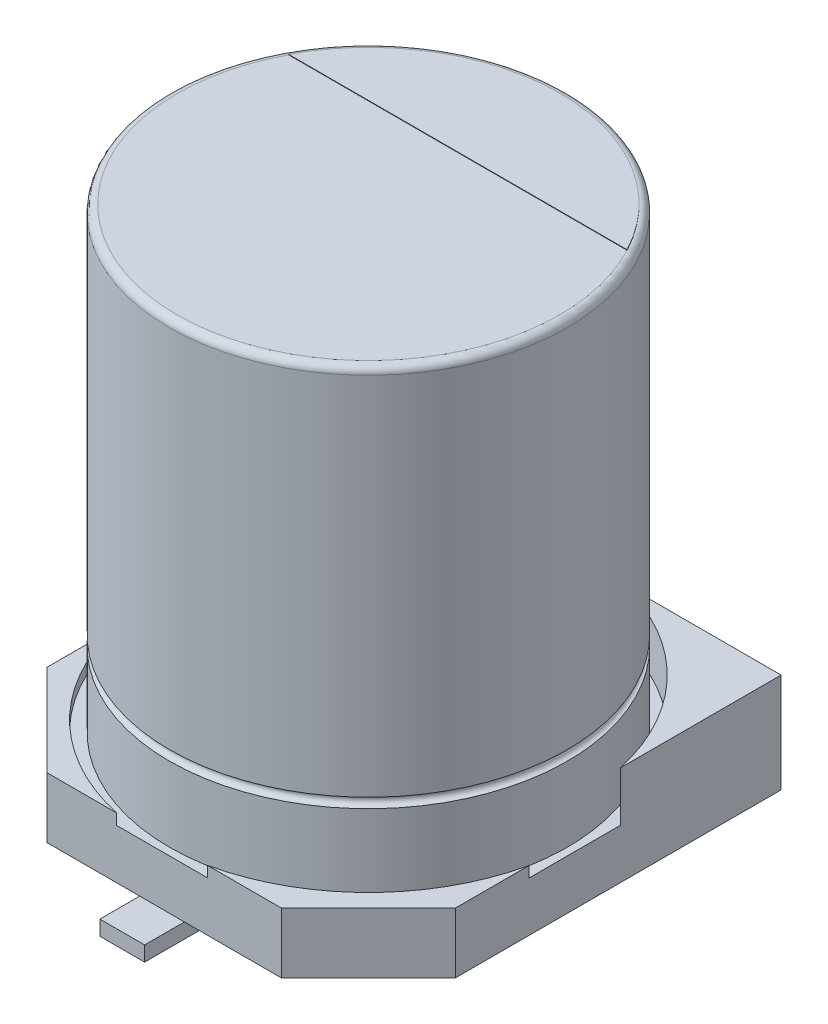
ISO-10303-21;
HEADER;
FILE_DESCRIPTION(('STEP AP214'),'2;1');
FILE_NAME('part.step','',(''),(''),'','','');
FILE_SCHEMA(('AUTOMOTIVE_DESIGN { 1 0 10303 214 1 1 1 1 }'));
ENDSEC;
DATA;
#1=APPLICATION_CONTEXT('core data for automotive mechanical design processes');
#2=APPLICATION_PROTOCOL_DEFINITION('international standard','automotive_design',2000,#1);
#3=PRODUCT_CONTEXT('',#1,'mechanical');
#4=PRODUCT('Part','Part','',(#3));
#5=PRODUCT_RELATED_PRODUCT_CATEGORY('part','',(#4));
#6=PRODUCT_DEFINITION_FORMATION('','',#4);
#7=PRODUCT_DEFINITION_CONTEXT('part definition',#1,'design');
#8=PRODUCT_DEFINITION('design','',#6,#7);
#9=PRODUCT_DEFINITION_SHAPE('','',#8);
#10=(LENGTH_UNIT() NAMED_UNIT(*) SI_UNIT(.MILLI.,.METRE.));
#11=(NAMED_UNIT(*) PLANE_ANGLE_UNIT() SI_UNIT($,.RADIAN.));
#12=(NAMED_UNIT(*) SI_UNIT($,.STERADIAN.) SOLID_ANGLE_UNIT());
#13=UNCERTAINTY_MEASURE_WITH_UNIT(LENGTH_MEASURE(1.E-05),#10,'distance_accuracy_value','');
#14=(GEOMETRIC_REPRESENTATION_CONTEXT(3) GLOBAL_UNCERTAINTY_ASSIGNED_CONTEXT((#13)) GLOBAL_UNIT_ASSIGNED_CONTEXT((#10,
#11,#12)) REPRESENTATION_CONTEXT('',''));
#15=CARTESIAN_POINT('',(0.,0.,0.));
#16=DIRECTION('',(0.,0.,1.));
#17=DIRECTION('',(1.,0.,0.));
#18=AXIS2_PLACEMENT_3D('',#15,#16,#17);
#19=CARTESIAN_POINT('',(0.,0.,0.));
#20=DIRECTION('',(0.,-1.,0.));
#21=DIRECTION('',(0.,0.,-1.));
#22=AXIS2_PLACEMENT_3D('',#19,#20,#21);
#23=PLANE('',#22);
#24=DIRECTION('',(-1.,0.,0.));
#25=VECTOR('',#24,1.);
#26=CARTESIAN_POINT('',(0.45,0.,-1.55));
#27=LINE('',#26,#25);
#28=CARTESIAN_POINT('',(0.45,0.,-1.55));
#29=VERTEX_POINT('',#28);
#30=CARTESIAN_POINT('',(-0.45,0.,-1.55));
#31=VERTEX_POINT('',#30);
#32=EDGE_CURVE('E522',#29,#31,#27,.T.);
#33=ORIENTED_EDGE('',*,*,#32,.F.);
#34=DIRECTION('',(0.,0.,-1.));
#35=VECTOR('',#34,1.);
#36=CARTESIAN_POINT('',(0.45,0.,0.));
#37=LINE('',#36,#35);
#38=CARTESIAN_POINT('',(0.45,0.,-4.15));
#39=VERTEX_POINT('',#38);
#40=EDGE_CURVE('E11',#29,#39,#37,.T.);
#41=ORIENTED_EDGE('',*,*,#40,.T.);
#42=DIRECTION('',(-1.,0.,0.));
#43=VECTOR('',#42,1.);
#44=CARTESIAN_POINT('',(-4.15,0.,-4.15));
#45=LINE('',#44,#43);
#46=CARTESIAN_POINT('',(4.15,0.,-4.15));
#47=VERTEX_POINT('',#46);
#48=EDGE_CURVE('E350',#47,#39,#45,.T.);
#49=ORIENTED_EDGE('',*,*,#48,.F.);
#50=DIRECTION('',(0.,0.,-1.));
#51=VECTOR('',#50,1.);
#52=CARTESIAN_POINT('',(4.15,0.,-4.15));
#53=LINE('',#52,#51);
#54=CARTESIAN_POINT('',(4.15,0.,2.40263157894746));
#55=VERTEX_POINT('',#54);
#56=EDGE_CURVE('E370',#55,#47,#53,.T.);
#57=ORIENTED_EDGE('',*,*,#56,.F.);
#58=DIRECTION('',(0.707106781186544,0.,-0.707106781186551));
#59=VECTOR('',#58,1.);
#60=CARTESIAN_POINT('',(4.15,0.,2.40263157894746));
#61=LINE('',#60,#59);
#62=CARTESIAN_POINT('',(2.40263157894748,0.,4.15));
#63=VERTEX_POINT('',#62);
#64=EDGE_CURVE('E366',#63,#55,#61,.T.);
#65=ORIENTED_EDGE('',*,*,#64,.F.);
#66=DIRECTION('',(1.,0.,0.));
#67=VECTOR('',#66,1.);
#68=CARTESIAN_POINT('',(2.40263157894748,0.,4.15));
#69=LINE('',#68,#67);
#70=CARTESIAN_POINT('',(0.45,0.,4.15));
#71=VERTEX_POINT('',#70);
#72=EDGE_CURVE('E362',#71,#63,#69,.T.);
#73=ORIENTED_EDGE('',*,*,#72,.F.);
#74=DIRECTION('',(0.,0.,1.));
#75=VECTOR('',#74,1.);
#76=CARTESIAN_POINT('',(0.45,0.,1.55));
#77=LINE('',#76,#75);
#78=CARTESIAN_POINT('',(0.45,0.,1.55));
#79=VERTEX_POINT('',#78);
#80=EDGE_CURVE('E251',#79,#71,#77,.T.);
#81=ORIENTED_EDGE('',*,*,#80,.F.);
#82=DIRECTION('',(1.,0.,0.));
#83=VECTOR('',#82,1.);
#84=CARTESIAN_POINT('',(0.45,0.,1.55));
#85=LINE('',#84,#83);
#86=CARTESIAN_POINT('',(-0.45,0.,1.55));
#87=VERTEX_POINT('',#86);
#88=EDGE_CURVE('E58',#87,#79,#85,.T.);
#89=ORIENTED_EDGE('',*,*,#88,.F.);
#90=DIRECTION('',(0.,0.,-1.));
#91=VECTOR('',#90,1.);
#92=CARTESIAN_POINT('',(-0.45,0.,1.55));
#93=LINE('',#92,#91);
#94=CARTESIAN_POINT('',(-0.45,0.,4.15));
#95=VERTEX_POINT('',#94);
#96=EDGE_CURVE('E43',#95,#87,#93,.T.);
#97=ORIENTED_EDGE('',*,*,#96,.F.);
#98=CARTESIAN_POINT('',(-2.31526315789467,0.,4.15));
#99=VERTEX_POINT('',#98);
#100=EDGE_CURVE('E363',#99,#95,#69,.T.);
#101=ORIENTED_EDGE('',*,*,#100,.F.);
#102=DIRECTION('',(0.707106781186551,0.,0.707106781186544));
#103=VECTOR('',#102,1.);
#104=CARTESIAN_POINT('',(-2.31526315789467,0.,4.15));
#105=LINE('',#104,#103);
#106=CARTESIAN_POINT('',(-4.15,0.,2.31526315789469));
#107=VERTEX_POINT('',#106);
#108=EDGE_CURVE('E359',#107,#99,#105,.T.);
#109=ORIENTED_EDGE('',*,*,#108,.F.);
#110=DIRECTION('',(0.,0.,1.));
#111=VECTOR('',#110,1.);
#112=CARTESIAN_POINT('',(-4.15,0.,2.31526315789469));
#113=LINE('',#112,#111);
#114=CARTESIAN_POINT('',(-4.15,0.,-4.15));
#115=VERTEX_POINT('',#114);
#116=EDGE_CURVE('E345',#115,#107,#113,.T.);
#117=ORIENTED_EDGE('',*,*,#116,.F.);
#118=CARTESIAN_POINT('',(-0.45,0.,-4.15));
#119=VERTEX_POINT('',#118);
#120=EDGE_CURVE('E372',#119,#115,#45,.T.);
#121=ORIENTED_EDGE('',*,*,#120,.F.);
#122=DIRECTION('',(0.,0.,-1.));
#123=VECTOR('',#122,1.);
#124=CARTESIAN_POINT('',(-0.45,0.,-1.55));
#125=LINE('',#124,#123);
#126=EDGE_CURVE('E513',#31,#119,#125,.T.);
#127=ORIENTED_EDGE('',*,*,#126,.F.);
#128=EDGE_LOOP('',(#33,#41,#49,#57,#65,#73,#81,#89,#97,#101,#109,#117,#121,#127));
#129=FACE_BOUND('',#128,.T.);
#130=ADVANCED_FACE('F35',(#129),#23,.T.);
#131=CARTESIAN_POINT('',(-3.85,10.2,0.));
#132=DIRECTION('',(0.,1.,0.));
#133=DIRECTION('',(0.,0.,1.));
#134=AXIS2_PLACEMENT_3D('',#131,#132,#133);
#135=PLANE('',#134);
#136=CARTESIAN_POINT('',(0.,10.2,0.));
#137=DIRECTION('',(0.,1.,0.));
#138=DIRECTION('',(0.,0.,1.));
#139=AXIS2_PLACEMENT_3D('',#136,#137,#138);
#140=CIRCLE('',#139,3.85);
#141=CARTESIAN_POINT('',(-3.40362150657537,10.2,-1.79940563519669));
#142=VERTEX_POINT('',#141);
#143=CARTESIAN_POINT('',(3.40362150657537,10.2,-1.79940563519669));
#144=VERTEX_POINT('',#143);
#145=EDGE_CURVE('E289',#142,#144,#140,.T.);
#146=ORIENTED_EDGE('',*,*,#145,.T.);
#147=DIRECTION('',(1.,0.,0.));
#148=VECTOR('',#147,1.);
#149=CARTESIAN_POINT('',(-3.40362150657537,10.2,-1.79940563519669));
#150=LINE('',#149,#148);
#151=EDGE_CURVE('E266',#142,#144,#150,.T.);
#152=ORIENTED_EDGE('',*,*,#151,.F.);
#153=EDGE_LOOP('',(#146,#152));
#154=FACE_BOUND('',#153,.T.);
#155=ADVANCED_FACE('F482',(#154),#135,.T.);
#156=CARTESIAN_POINT('',(0.,2.,0.));
#157=DIRECTION('',(0.,-1.,0.));
#158=DIRECTION('',(0.,0.,-1.));
#159=AXIS2_PLACEMENT_3D('',#156,#157,#158);
#160=PLANE('',#159);
#161=DIRECTION('',(-1.,0.,0.));
#162=VECTOR('',#161,1.);
#163=CARTESIAN_POINT('',(-4.15,2.,-4.15));
#164=LINE('',#163,#162);
#165=CARTESIAN_POINT('',(4.15,2.,-4.15));
#166=VERTEX_POINT('',#165);
#167=CARTESIAN_POINT('',(0.916515138991169,2.,-4.15));
#168=VERTEX_POINT('',#167);
#169=EDGE_CURVE('E353',#166,#168,#164,.T.);
#170=ORIENTED_EDGE('',*,*,#169,.T.);
#171=CARTESIAN_POINT('',(0.,2.,0.));
#172=DIRECTION('',(0.,-1.,0.));
#173=DIRECTION('',(0.,0.,-1.));
#174=AXIS2_PLACEMENT_3D('',#171,#172,#173);
#175=CIRCLE('',#174,4.25);
#176=CARTESIAN_POINT('',(4.15,2.,-0.916515138991167));
#177=VERTEX_POINT('',#176);
#178=EDGE_CURVE('E393',#168,#177,#175,.T.);
#179=ORIENTED_EDGE('',*,*,#178,.T.);
#180=DIRECTION('',(0.,0.,-1.));
#181=VECTOR('',#180,1.);
#182=CARTESIAN_POINT('',(4.15,2.,-4.15));
#183=LINE('',#182,#181);
#184=EDGE_CURVE('E349',#177,#166,#183,.T.);
#185=ORIENTED_EDGE('',*,*,#184,.T.);
#186=EDGE_LOOP('',(#170,#179,#185));
#187=FACE_BOUND('',#186,.T.);
#188=ADVANCED_FACE('F444',(#187),#160,.F.);
#189=CARTESIAN_POINT('',(-4.15,2.,2.31526315789469));
#190=DIRECTION('',(1.,0.,0.));
#191=DIRECTION('',(0.,0.,-1.));
#192=AXIS2_PLACEMENT_3D('',#189,#190,#191);
#193=PLANE('',#192);
#194=DIRECTION('',(0.,-1.,0.));
#195=VECTOR('',#194,1.);
#196=CARTESIAN_POINT('',(-4.15,2.,2.31526315789469));
#197=LINE('',#196,#195);
#198=CARTESIAN_POINT('',(-4.15,1.21736242578591,2.31526315789469));
#199=VERTEX_POINT('',#198);
#200=EDGE_CURVE('E388',#199,#107,#197,.T.);
#201=ORIENTED_EDGE('',*,*,#200,.F.);
#202=DIRECTION('',(0.,0.,1.));
#203=VECTOR('',#202,1.);
#204=CARTESIAN_POINT('',(-4.15,1.21736242578591,0.916515138991169));
#205=LINE('',#204,#203);
#206=CARTESIAN_POINT('',(-4.15,1.21736242578591,0.916515138991169));
#207=VERTEX_POINT('',#206);
#208=EDGE_CURVE('E293',#207,#199,#205,.T.);
#209=ORIENTED_EDGE('',*,*,#208,.F.);
#210=DIRECTION('',(0.,1.,0.));
#211=VECTOR('',#210,1.);
#212=CARTESIAN_POINT('',(-4.15,1.,0.916515138991169));
#213=LINE('',#212,#211);
#214=CARTESIAN_POINT('',(-4.15,1.,0.916515138991169));
#215=VERTEX_POINT('',#214);
#216=EDGE_CURVE('E332',#207,#215,#213,.F.);
#217=ORIENTED_EDGE('',*,*,#216,.T.);
#218=DIRECTION('',(0.,0.,1.));
#219=VECTOR('',#218,1.);
#220=CARTESIAN_POINT('',(-4.15,1.,2.31526315789469));
#221=LINE('',#220,#219);
#222=CARTESIAN_POINT('',(-4.15,1.,-0.916515138991169));
#223=VERTEX_POINT('',#222);
#224=EDGE_CURVE('E342',#223,#215,#221,.T.);
#225=ORIENTED_EDGE('',*,*,#224,.F.);
#226=DIRECTION('',(0.,1.,0.));
#227=VECTOR('',#226,1.);
#228=CARTESIAN_POINT('',(-4.15,1.,-0.916515138991169));
#229=LINE('',#228,#227);
#230=CARTESIAN_POINT('',(-4.15,2.,-0.916515138991169));
#231=VERTEX_POINT('',#230);
#232=EDGE_CURVE('E334',#223,#231,#229,.T.);
#233=ORIENTED_EDGE('',*,*,#232,.T.);
#234=DIRECTION('',(0.,0.,1.));
#235=VECTOR('',#234,1.);
#236=CARTESIAN_POINT('',(-4.15,2.,2.31526315789469));
#237=LINE('',#236,#235);
#238=CARTESIAN_POINT('',(-4.15,2.,-4.15));
#239=VERTEX_POINT('',#238);
#240=EDGE_CURVE('E346',#239,#231,#237,.T.);
#241=ORIENTED_EDGE('',*,*,#240,.F.);
#242=DIRECTION('',(0.,-1.,0.));
#243=VECTOR('',#242,1.);
#244=CARTESIAN_POINT('',(-4.15,2.,-4.15));
#245=LINE('',#244,#243);
#246=EDGE_CURVE('E356',#239,#115,#245,.T.);
#247=ORIENTED_EDGE('',*,*,#246,.T.);
#248=ORIENTED_EDGE('',*,*,#116,.T.);
#249=EDGE_LOOP('',(#201,#209,#217,#225,#233,#241,#247,#248));
#250=FACE_BOUND('',#249,.T.);
#251=ADVANCED_FACE('F37',(#250),#193,.F.);
#252=CARTESIAN_POINT('',(-2.31526315789467,2.,4.15));
#253=DIRECTION('',(0.707106781186544,0.,-0.707106781186551));
#254=DIRECTION('',(-0.707106781186551,0.,-0.707106781186544));
#255=AXIS2_PLACEMENT_3D('',#252,#253,#254);
#256=PLANE('',#255);
#257=DIRECTION('',(0.,-1.,0.));
#258=VECTOR('',#257,1.);
#259=CARTESIAN_POINT('',(-2.31526315789467,2.,4.15));
#260=LINE('',#259,#258);
#261=CARTESIAN_POINT('',(-2.31526315789467,1.21736242578591,4.15));
#262=VERTEX_POINT('',#261);
#263=EDGE_CURVE('E386',#262,#99,#260,.T.);
#264=ORIENTED_EDGE('',*,*,#263,.F.);
#265=DIRECTION('',(-0.707106781186551,0.,-0.707106781186544));
#266=VECTOR('',#265,1.);
#267=CARTESIAN_POINT('',(-2.31526315789467,1.21736242578591,4.15));
#268=LINE('',#267,#266);
#269=EDGE_CURVE('E307',#262,#199,#268,.T.);
#270=ORIENTED_EDGE('',*,*,#269,.T.);
#271=ORIENTED_EDGE('',*,*,#200,.T.);
#272=ORIENTED_EDGE('',*,*,#108,.T.);
#273=EDGE_LOOP('',(#264,#270,#271,#272));
#274=FACE_BOUND('',#273,.T.);
#275=ADVANCED_FACE('F498',(#274),#256,.F.);
#276=CARTESIAN_POINT('',(2.40263157894748,2.,4.15));
#277=DIRECTION('',(0.,0.,-1.));
#278=DIRECTION('',(-1.,0.,0.));
#279=AXIS2_PLACEMENT_3D('',#276,#277,#278);
#280=PLANE('',#279);
#281=DIRECTION('',(0.,-1.,0.));
#282=VECTOR('',#281,1.);
#283=CARTESIAN_POINT('',(2.40263157894748,2.,4.15));
#284=LINE('',#283,#282);
#285=CARTESIAN_POINT('',(2.40263157894748,1.21736242578591,4.15));
#286=VERTEX_POINT('',#285);
#287=EDGE_CURVE('E383',#286,#63,#284,.T.);
#288=ORIENTED_EDGE('',*,*,#287,.F.);
#289=DIRECTION('',(-1.,0.,0.));
#290=VECTOR('',#289,1.);
#291=CARTESIAN_POINT('',(2.40263157894748,1.21736242578591,4.15));
#292=LINE('',#291,#290);
#293=CARTESIAN_POINT('',(0.916515138991166,1.21736242578591,4.15));
#294=VERTEX_POINT('',#293);
#295=EDGE_CURVE('E297',#286,#294,#292,.T.);
#296=ORIENTED_EDGE('',*,*,#295,.T.);
#297=DIRECTION('',(0.,1.,0.));
#298=VECTOR('',#297,1.);
#299=CARTESIAN_POINT('',(0.916515138991166,1.,4.15));
#300=LINE('',#299,#298);
#301=CARTESIAN_POINT('',(0.916515138991166,1.,4.15));
#302=VERTEX_POINT('',#301);
#303=EDGE_CURVE('E327',#294,#302,#300,.F.);
#304=ORIENTED_EDGE('',*,*,#303,.T.);
#305=DIRECTION('',(1.,0.,0.));
#306=VECTOR('',#305,1.);
#307=CARTESIAN_POINT('',(2.40263157894748,1.,4.15));
#308=LINE('',#307,#306);
#309=CARTESIAN_POINT('',(-0.916515138991165,1.,4.15));
#310=VERTEX_POINT('',#309);
#311=EDGE_CURVE('E339',#310,#302,#308,.T.);
#312=ORIENTED_EDGE('',*,*,#311,.F.);
#313=DIRECTION('',(0.,1.,0.));
#314=VECTOR('',#313,1.);
#315=CARTESIAN_POINT('',(-0.916515138991165,1.,4.15));
#316=LINE('',#315,#314);
#317=CARTESIAN_POINT('',(-0.916515138991165,1.21736242578591,4.15));
#318=VERTEX_POINT('',#317);
#319=EDGE_CURVE('E329',#310,#318,#316,.T.);
#320=ORIENTED_EDGE('',*,*,#319,.T.);
#321=EDGE_CURVE('E301',#318,#262,#292,.T.);
#322=ORIENTED_EDGE('',*,*,#321,.T.);
#323=ORIENTED_EDGE('',*,*,#263,.T.);
#324=ORIENTED_EDGE('',*,*,#100,.T.);
#325=EDGE_CURVE('E367',#95,#71,#69,.T.);
#326=ORIENTED_EDGE('',*,*,#325,.T.);
#327=ORIENTED_EDGE('',*,*,#72,.T.);
#328=EDGE_LOOP('',(#288,#296,#304,#312,#320,#322,#323,#324,#326,#327));
#329=FACE_BOUND('',#328,.T.);
#330=ADVANCED_FACE('F425',(#329),#280,.F.);
#331=CARTESIAN_POINT('',(4.15,2.,2.40263157894746));
#332=DIRECTION('',(-0.707106781186551,0.,-0.707106781186544));
#333=DIRECTION('',(-0.707106781186544,0.,0.707106781186551));
#334=AXIS2_PLACEMENT_3D('',#331,#332,#333);
#335=PLANE('',#334);
#336=DIRECTION('',(0.,-1.,0.));
#337=VECTOR('',#336,1.);
#338=CARTESIAN_POINT('',(4.15,2.,2.40263157894746));
#339=LINE('',#338,#337);
#340=CARTESIAN_POINT('',(4.15,1.21736242578591,2.40263157894746));
#341=VERTEX_POINT('',#340);
#342=EDGE_CURVE('E381',#341,#55,#339,.T.);
#343=ORIENTED_EDGE('',*,*,#342,.F.);
#344=DIRECTION('',(-0.707106781186544,0.,0.707106781186551));
#345=VECTOR('',#344,1.);
#346=CARTESIAN_POINT('',(4.15,1.21736242578591,2.40263157894746));
#347=LINE('',#346,#345);
#348=EDGE_CURVE('E300',#341,#286,#347,.T.);
#349=ORIENTED_EDGE('',*,*,#348,.T.);
#350=ORIENTED_EDGE('',*,*,#287,.T.);
#351=ORIENTED_EDGE('',*,*,#64,.T.);
#352=EDGE_LOOP('',(#343,#349,#350,#351));
#353=FACE_BOUND('',#352,.T.);
#354=ADVANCED_FACE('F429',(#353),#335,.F.);
#355=CARTESIAN_POINT('',(4.15,2.,-4.15));
#356=DIRECTION('',(-1.,0.,0.));
#357=DIRECTION('',(0.,0.,1.));
#358=AXIS2_PLACEMENT_3D('',#355,#356,#357);
#359=PLANE('',#358);
#360=DIRECTION('',(0.,1.,0.));
#361=VECTOR('',#360,1.);
#362=CARTESIAN_POINT('',(4.15,1.,0.916515138991164));
#363=LINE('',#362,#361);
#364=CARTESIAN_POINT('',(4.15,1.,0.916515138991164));
#365=VERTEX_POINT('',#364);
#366=CARTESIAN_POINT('',(4.15,1.21736242578591,0.916515138991164));
#367=VERTEX_POINT('',#366);
#368=EDGE_CURVE('E324',#365,#367,#363,.T.);
#369=ORIENTED_EDGE('',*,*,#368,.T.);
#370=DIRECTION('',(0.,0.,-1.));
#371=VECTOR('',#370,1.);
#372=CARTESIAN_POINT('',(4.15,1.21736242578591,0.91651513899117));
#373=LINE('',#372,#371);
#374=EDGE_CURVE('E295',#341,#367,#373,.T.);
#375=ORIENTED_EDGE('',*,*,#374,.F.);
#376=ORIENTED_EDGE('',*,*,#342,.T.);
#377=ORIENTED_EDGE('',*,*,#56,.T.);
#378=DIRECTION('',(0.,-1.,0.));
#379=VECTOR('',#378,1.);
#380=CARTESIAN_POINT('',(4.15,2.,-4.15));
#381=LINE('',#380,#379);
#382=EDGE_CURVE('E378',#166,#47,#381,.T.);
#383=ORIENTED_EDGE('',*,*,#382,.F.);
#384=ORIENTED_EDGE('',*,*,#184,.F.);
#385=DIRECTION('',(0.,1.,0.));
#386=VECTOR('',#385,1.);
#387=CARTESIAN_POINT('',(4.15,1.,-0.916515138991167));
#388=LINE('',#387,#386);
#389=CARTESIAN_POINT('',(4.15,1.,-0.916515138991167));
#390=VERTEX_POINT('',#389);
#391=EDGE_CURVE('E321',#177,#390,#388,.F.);
#392=ORIENTED_EDGE('',*,*,#391,.T.);
#393=DIRECTION('',(0.,0.,-1.));
#394=VECTOR('',#393,1.);
#395=CARTESIAN_POINT('',(4.15,1.,-4.15));
#396=LINE('',#395,#394);
#397=EDGE_CURVE('E337',#365,#390,#396,.T.);
#398=ORIENTED_EDGE('',*,*,#397,.F.);
#399=EDGE_LOOP('',(#369,#375,#376,#377,#383,#384,#392,#398));
#400=FACE_BOUND('',#399,.T.);
#401=ADVANCED_FACE('F434',(#400),#359,.F.);
#402=CARTESIAN_POINT('',(-4.15,2.,-4.15));
#403=DIRECTION('',(0.,0.,1.));
#404=DIRECTION('',(1.,0.,0.));
#405=AXIS2_PLACEMENT_3D('',#402,#403,#404);
#406=PLANE('',#405);
#407=DIRECTION('',(-1.,0.,0.));
#408=VECTOR('',#407,1.);
#409=CARTESIAN_POINT('',(-4.15,1.,-4.15));
#410=LINE('',#409,#408);
#411=CARTESIAN_POINT('',(0.916515138991161,1.,-4.15));
#412=VERTEX_POINT('',#411);
#413=CARTESIAN_POINT('',(-0.916515138991162,1.,-4.15));
#414=VERTEX_POINT('',#413);
#415=EDGE_CURVE('E394',#412,#414,#410,.T.);
#416=ORIENTED_EDGE('',*,*,#415,.F.);
#417=DIRECTION('',(0.,1.,0.));
#418=VECTOR('',#417,1.);
#419=CARTESIAN_POINT('',(0.916515138991161,1.,-4.15));
#420=LINE('',#419,#418);
#421=EDGE_CURVE('E318',#412,#168,#420,.T.);
#422=ORIENTED_EDGE('',*,*,#421,.T.);
#423=ORIENTED_EDGE('',*,*,#169,.F.);
#424=ORIENTED_EDGE('',*,*,#382,.T.);
#425=ORIENTED_EDGE('',*,*,#48,.T.);
#426=EDGE_CURVE('E375',#39,#119,#45,.T.);
#427=ORIENTED_EDGE('',*,*,#426,.T.);
#428=ORIENTED_EDGE('',*,*,#120,.T.);
#429=ORIENTED_EDGE('',*,*,#246,.F.);
#430=CARTESIAN_POINT('',(-0.91651513899117,2.,-4.15));
#431=VERTEX_POINT('',#430);
#432=EDGE_CURVE('E352',#431,#239,#164,.T.);
#433=ORIENTED_EDGE('',*,*,#432,.F.);
#434=DIRECTION('',(0.,1.,0.));
#435=VECTOR('',#434,1.);
#436=CARTESIAN_POINT('',(-0.916515138991162,1.,-4.15));
#437=LINE('',#436,#435);
#438=EDGE_CURVE('E314',#431,#414,#437,.F.);
#439=ORIENTED_EDGE('',*,*,#438,.T.);
#440=EDGE_LOOP('',(#416,#422,#423,#424,#425,#427,#428,#429,#433,#439));
#441=FACE_BOUND('',#440,.T.);
#442=ADVANCED_FACE('F440',(#441),#406,.F.);
#443=ORIENTED_EDGE('',*,*,#240,.T.);
#444=EDGE_CURVE('E390',#231,#431,#175,.T.);
#445=ORIENTED_EDGE('',*,*,#444,.T.);
#446=ORIENTED_EDGE('',*,*,#432,.T.);
#447=EDGE_LOOP('',(#443,#445,#446));
#448=FACE_BOUND('',#447,.T.);
#449=ADVANCED_FACE('F490',(#448),#160,.F.);
#450=CARTESIAN_POINT('',(0.,1.,0.));
#451=DIRECTION('',(0.,1.,0.));
#452=DIRECTION('',(0.,0.,1.));
#453=AXIS2_PLACEMENT_3D('',#450,#451,#452);
#454=PLANE('',#453);
#455=CARTESIAN_POINT('',(0.,1.,0.));
#456=DIRECTION('',(0.,1.,0.));
#457=DIRECTION('',(0.,0.,1.));
#458=AXIS2_PLACEMENT_3D('',#455,#456,#457);
#459=CIRCLE('',#458,4.);
#460=CARTESIAN_POINT('',(0.,1.,4.));
#461=VERTEX_POINT('',#460);
#462=EDGE_CURVE('E398',#461,#461,#459,.T.);
#463=ORIENTED_EDGE('',*,*,#462,.F.);
#464=EDGE_LOOP('',(#463));
#465=FACE_BOUND('',#464,.T.);
#466=ORIENTED_EDGE('',*,*,#224,.T.);
#467=CARTESIAN_POINT('',(0.,1.,0.));
#468=DIRECTION('',(0.,1.,0.));
#469=DIRECTION('',(0.,0.,1.));
#470=AXIS2_PLACEMENT_3D('',#467,#468,#469);
#471=CIRCLE('',#470,4.25);
#472=EDGE_CURVE('E310',#215,#310,#471,.T.);
#473=ORIENTED_EDGE('',*,*,#472,.T.);
#474=ORIENTED_EDGE('',*,*,#311,.T.);
#475=EDGE_CURVE('E311',#302,#365,#471,.T.);
#476=ORIENTED_EDGE('',*,*,#475,.T.);
#477=ORIENTED_EDGE('',*,*,#397,.T.);
#478=EDGE_CURVE('E315',#390,#412,#471,.T.);
#479=ORIENTED_EDGE('',*,*,#478,.T.);
#480=ORIENTED_EDGE('',*,*,#415,.T.);
#481=EDGE_CURVE('E451',#414,#223,#471,.T.);
#482=ORIENTED_EDGE('',*,*,#481,.T.);
#483=EDGE_LOOP('',(#466,#473,#474,#476,#477,#479,#480,#482));
#484=FACE_BOUND('',#483,.T.);
#485=ADVANCED_FACE('F458',(#465,#484),#454,.T.);
#486=CARTESIAN_POINT('',(0.,1.,0.));
#487=DIRECTION('',(0.,1.,0.));
#488=DIRECTION('',(0.,0.,1.));
#489=AXIS2_PLACEMENT_3D('',#486,#487,#488);
#490=CYLINDRICAL_SURFACE('',#489,4.25);
#491=ORIENTED_EDGE('',*,*,#481,.F.);
#492=ORIENTED_EDGE('',*,*,#438,.F.);
#493=ORIENTED_EDGE('',*,*,#444,.F.);
#494=ORIENTED_EDGE('',*,*,#232,.F.);
#495=EDGE_LOOP('',(#491,#492,#493,#494));
#496=FACE_BOUND('',#495,.T.);
#497=ADVANCED_FACE('F478',(#496),#490,.F.);
#498=ORIENTED_EDGE('',*,*,#216,.F.);
#499=CARTESIAN_POINT('',(0.,1.21736242578591,0.));
#500=DIRECTION('',(0.,-1.,0.));
#501=DIRECTION('',(0.,0.,-1.));
#502=AXIS2_PLACEMENT_3D('',#499,#500,#501);
#503=CIRCLE('',#502,4.25);
#504=EDGE_CURVE('E304',#207,#318,#503,.F.);
#505=ORIENTED_EDGE('',*,*,#504,.T.);
#506=ORIENTED_EDGE('',*,*,#319,.F.);
#507=ORIENTED_EDGE('',*,*,#472,.F.);
#508=EDGE_LOOP('',(#498,#505,#506,#507));
#509=FACE_BOUND('',#508,.T.);
#510=ADVANCED_FACE('F509',(#509),#490,.F.);
#511=ORIENTED_EDGE('',*,*,#303,.F.);
#512=CARTESIAN_POINT('',(0.,1.21736242578591,0.));
#513=DIRECTION('',(0.,-1.,0.));
#514=DIRECTION('',(0.,0.,-1.));
#515=AXIS2_PLACEMENT_3D('',#512,#513,#514);
#516=CIRCLE('',#515,4.25);
#517=EDGE_CURVE('E396',#294,#367,#516,.F.);
#518=ORIENTED_EDGE('',*,*,#517,.T.);
#519=ORIENTED_EDGE('',*,*,#368,.F.);
#520=ORIENTED_EDGE('',*,*,#475,.F.);
#521=EDGE_LOOP('',(#511,#518,#519,#520));
#522=FACE_BOUND('',#521,.T.);
#523=ADVANCED_FACE('F465',(#522),#490,.F.);
#524=ORIENTED_EDGE('',*,*,#178,.F.);
#525=ORIENTED_EDGE('',*,*,#421,.F.);
#526=ORIENTED_EDGE('',*,*,#478,.F.);
#527=ORIENTED_EDGE('',*,*,#391,.F.);
#528=EDGE_LOOP('',(#524,#525,#526,#527));
#529=FACE_BOUND('',#528,.T.);
#530=ADVANCED_FACE('F448',(#529),#490,.F.);
#531=CARTESIAN_POINT('',(7.7317925887353,1.21736242578591,0.916515138991169));
#532=DIRECTION('',(0.,-1.,0.));
#533=DIRECTION('',(0.,0.,-1.));
#534=AXIS2_PLACEMENT_3D('',#531,#532,#533);
#535=PLANE('',#534);
#536=ORIENTED_EDGE('',*,*,#374,.T.);
#537=ORIENTED_EDGE('',*,*,#517,.F.);
#538=ORIENTED_EDGE('',*,*,#295,.F.);
#539=ORIENTED_EDGE('',*,*,#348,.F.);
#540=EDGE_LOOP('',(#536,#537,#538,#539));
#541=FACE_BOUND('',#540,.T.);
#542=ADVANCED_FACE('F467',(#541),#535,.F.);
#543=ORIENTED_EDGE('',*,*,#321,.F.);
#544=ORIENTED_EDGE('',*,*,#504,.F.);
#545=ORIENTED_EDGE('',*,*,#208,.T.);
#546=ORIENTED_EDGE('',*,*,#269,.F.);
#547=EDGE_LOOP('',(#543,#544,#545,#546));
#548=FACE_BOUND('',#547,.T.);
#549=ADVANCED_FACE('F469',(#548),#535,.F.);
#550=CARTESIAN_POINT('',(0.,10.05,0.));
#551=DIRECTION('',(0.,1.,0.));
#552=DIRECTION('',(0.,0.,1.));
#553=AXIS2_PLACEMENT_3D('',#550,#551,#552);
#554=TOROIDAL_SURFACE('',#553,3.85,0.15);
#555=CARTESIAN_POINT('',(0.,10.05,0.));
#556=DIRECTION('',(0.,1.,0.));
#557=DIRECTION('',(0.,0.,1.));
#558=AXIS2_PLACEMENT_3D('',#555,#556,#557);
#559=CIRCLE('',#558,4.);
#560=CARTESIAN_POINT('',(0.,10.05,4.));
#561=VERTEX_POINT('',#560);
#562=EDGE_CURVE('E286',#561,#561,#559,.T.);
#563=ORIENTED_EDGE('',*,*,#562,.T.);
#564=EDGE_LOOP('',(#563));
#565=FACE_BOUND('',#564,.T.);
#566=EDGE_CURVE('E290',#144,#142,#140,.T.);
#567=ORIENTED_EDGE('',*,*,#566,.F.);
#568=ORIENTED_EDGE('',*,*,#145,.F.);
#569=EDGE_LOOP('',(#567,#568));
#570=FACE_BOUND('',#569,.T.);
#571=ADVANCED_FACE('F475',(#565,#570),#554,.T.);
#572=CARTESIAN_POINT('',(0.,10.2,0.));
#573=DIRECTION('',(0.,1.,0.));
#574=DIRECTION('',(0.,0.,1.));
#575=AXIS2_PLACEMENT_3D('',#572,#573,#574);
#576=CYLINDRICAL_SURFACE('',#575,4.);
#577=CARTESIAN_POINT('',(0.,2.7,0.));
#578=DIRECTION('',(0.,1.,0.));
#579=DIRECTION('',(0.,0.,1.));
#580=AXIS2_PLACEMENT_3D('',#577,#578,#579);
#581=CIRCLE('',#580,4.);
#582=CARTESIAN_POINT('',(0.,2.7,4.));
#583=VERTEX_POINT('',#582);
#584=EDGE_CURVE('E283',#583,#583,#581,.T.);
#585=ORIENTED_EDGE('',*,*,#584,.T.);
#586=EDGE_LOOP('',(#585));
#587=FACE_BOUND('',#586,.T.);
#588=ORIENTED_EDGE('',*,*,#562,.F.);
#589=EDGE_LOOP('',(#588));
#590=FACE_BOUND('',#589,.T.);
#591=ADVANCED_FACE('F580',(#587,#590),#576,.T.);
#592=CARTESIAN_POINT('',(0.,2.6,0.));
#593=DIRECTION('',(0.,1.,0.));
#594=DIRECTION('',(0.,0.,1.));
#595=AXIS2_PLACEMENT_3D('',#592,#593,#594);
#596=TOROIDAL_SURFACE('',#595,4.,0.1);
#597=CARTESIAN_POINT('',(0.,2.5,0.));
#598=DIRECTION('',(0.,1.,0.));
#599=DIRECTION('',(0.,0.,1.));
#600=AXIS2_PLACEMENT_3D('',#597,#598,#599);
#601=CIRCLE('',#600,4.);
#602=CARTESIAN_POINT('',(0.,2.5,4.));
#603=VERTEX_POINT('',#602);
#604=EDGE_CURVE('E280',#603,#603,#601,.T.);
#605=ORIENTED_EDGE('',*,*,#604,.T.);
#606=EDGE_LOOP('',(#605));
#607=FACE_BOUND('',#606,.T.);
#608=ORIENTED_EDGE('',*,*,#584,.F.);
#609=EDGE_LOOP('',(#608));
#610=FACE_BOUND('',#609,.T.);
#611=ADVANCED_FACE('F577',(#607,#610),#596,.F.);
#612=CARTESIAN_POINT('',(0.,10.2,0.));
#613=DIRECTION('',(0.,1.,0.));
#614=DIRECTION('',(0.,0.,1.));
#615=AXIS2_PLACEMENT_3D('',#612,#613,#614);
#616=CYLINDRICAL_SURFACE('',#615,4.);
#617=ORIENTED_EDGE('',*,*,#462,.T.);
#618=EDGE_LOOP('',(#617));
#619=FACE_BOUND('',#618,.T.);
#620=ORIENTED_EDGE('',*,*,#604,.F.);
#621=EDGE_LOOP('',(#620));
#622=FACE_BOUND('',#621,.T.);
#623=ADVANCED_FACE('F573',(#619,#622),#616,.T.);
#624=CARTESIAN_POINT('',(0.,10.21,0.));
#625=DIRECTION('',(0.,-1.,0.));
#626=DIRECTION('',(0.,0.,-1.));
#627=AXIS2_PLACEMENT_3D('',#624,#625,#626);
#628=CYLINDRICAL_SURFACE('',#627,3.85);
#629=ORIENTED_EDGE('',*,*,#566,.T.);
#630=DIRECTION('',(0.,-1.,0.));
#631=VECTOR('',#630,1.);
#632=CARTESIAN_POINT('',(-3.40362150657537,10.21,-1.79940563519669));
#633=LINE('',#632,#631);
#634=CARTESIAN_POINT('',(-3.40362150657537,10.21,-1.79940563519669));
#635=VERTEX_POINT('',#634);
#636=EDGE_CURVE('E277',#635,#142,#633,.T.);
#637=ORIENTED_EDGE('',*,*,#636,.F.);
#638=CARTESIAN_POINT('',(0.,10.21,0.));
#639=DIRECTION('',(0.,1.,0.));
#640=DIRECTION('',(0.,0.,1.));
#641=AXIS2_PLACEMENT_3D('',#638,#639,#640);
#642=CIRCLE('',#641,3.85);
#643=CARTESIAN_POINT('',(3.40362150657537,10.21,-1.79940563519669));
#644=VERTEX_POINT('',#643);
#645=EDGE_CURVE('E267',#644,#635,#642,.T.);
#646=ORIENTED_EDGE('',*,*,#645,.F.);
#647=DIRECTION('',(0.,-1.,0.));
#648=VECTOR('',#647,1.);
#649=CARTESIAN_POINT('',(3.40362150657537,10.21,-1.79940563519669));
#650=LINE('',#649,#648);
#651=EDGE_CURVE('E272',#644,#144,#650,.T.);
#652=ORIENTED_EDGE('',*,*,#651,.T.);
#653=EDGE_LOOP('',(#629,#637,#646,#652));
#654=FACE_BOUND('',#653,.T.);
#655=ADVANCED_FACE('F569',(#654),#628,.T.);
#656=CARTESIAN_POINT('',(-3.40362150657537,10.21,-1.79940563519669));
#657=DIRECTION('',(0.,0.,-1.));
#658=DIRECTION('',(-1.,0.,0.));
#659=AXIS2_PLACEMENT_3D('',#656,#657,#658);
#660=PLANE('',#659);
#661=ORIENTED_EDGE('',*,*,#151,.T.);
#662=ORIENTED_EDGE('',*,*,#651,.F.);
#663=DIRECTION('',(1.,0.,0.));
#664=VECTOR('',#663,1.);
#665=CARTESIAN_POINT('',(-3.40362150657537,10.21,-1.79940563519669));
#666=LINE('',#665,#664);
#667=EDGE_CURVE('E270',#635,#644,#666,.T.);
#668=ORIENTED_EDGE('',*,*,#667,.F.);
#669=ORIENTED_EDGE('',*,*,#636,.T.);
#670=EDGE_LOOP('',(#661,#662,#668,#669));
#671=FACE_BOUND('',#670,.T.);
#672=ADVANCED_FACE('F565',(#671),#660,.F.);
#673=CARTESIAN_POINT('',(0.,10.21,0.));
#674=DIRECTION('',(0.,1.,0.));
#675=DIRECTION('',(0.,0.,1.));
#676=AXIS2_PLACEMENT_3D('',#673,#674,#675);
#677=PLANE('',#676);
#678=ORIENTED_EDGE('',*,*,#645,.T.);
#679=ORIENTED_EDGE('',*,*,#667,.T.);
#680=EDGE_LOOP('',(#678,#679));
#681=FACE_BOUND('',#680,.T.);
#682=ADVANCED_FACE('F562',(#681),#677,.T.);
#683=CARTESIAN_POINT('',(-0.45,-0.3,1.55));
#684=DIRECTION('',(1.,0.,0.));
#685=DIRECTION('',(0.,0.,-1.));
#686=AXIS2_PLACEMENT_3D('',#683,#684,#685);
#687=PLANE('',#686);
#688=CARTESIAN_POINT('',(-0.45,0.,4.95));
#689=VERTEX_POINT('',#688);
#690=EDGE_CURVE('E230',#689,#95,#93,.T.);
#691=ORIENTED_EDGE('',*,*,#690,.T.);
#692=ORIENTED_EDGE('',*,*,#96,.T.);
#693=DIRECTION('',(0.,1.,0.));
#694=VECTOR('',#693,1.);
#695=CARTESIAN_POINT('',(-0.45,-0.3,1.55));
#696=LINE('',#695,#694);
#697=CARTESIAN_POINT('',(-0.45,-0.3,1.55));
#698=VERTEX_POINT('',#697);
#699=EDGE_CURVE('E263',#698,#87,#696,.T.);
#700=ORIENTED_EDGE('',*,*,#699,.F.);
#701=DIRECTION('',(0.,0.,-1.));
#702=VECTOR('',#701,1.);
#703=CARTESIAN_POINT('',(-0.45,-0.3,1.55));
#704=LINE('',#703,#702);
#705=CARTESIAN_POINT('',(-0.45,-0.3,4.95));
#706=VERTEX_POINT('',#705);
#707=EDGE_CURVE('E238',#706,#698,#704,.T.);
#708=ORIENTED_EDGE('',*,*,#707,.F.);
#709=DIRECTION('',(0.,1.,0.));
#710=VECTOR('',#709,1.);
#711=CARTESIAN_POINT('',(-0.45,-0.3,4.95));
#712=LINE('',#711,#710);
#713=EDGE_CURVE('E247',#706,#689,#712,.T.);
#714=ORIENTED_EDGE('',*,*,#713,.T.);
#715=EDGE_LOOP('',(#691,#692,#700,#708,#714));
#716=FACE_BOUND('',#715,.T.);
#717=ADVANCED_FACE('F404',(#716),#687,.F.);
#718=CARTESIAN_POINT('',(0.45,-0.3,1.55));
#719=DIRECTION('',(0.,0.,1.));
#720=DIRECTION('',(1.,0.,0.));
#721=AXIS2_PLACEMENT_3D('',#718,#719,#720);
#722=PLANE('',#721);
#723=ORIENTED_EDGE('',*,*,#88,.T.);
#724=DIRECTION('',(0.,1.,0.));
#725=VECTOR('',#724,1.);
#726=CARTESIAN_POINT('',(0.45,-0.3,1.55));
#727=LINE('',#726,#725);
#728=CARTESIAN_POINT('',(0.45,-0.3,1.55));
#729=VERTEX_POINT('',#728);
#730=EDGE_CURVE('E260',#729,#79,#727,.T.);
#731=ORIENTED_EDGE('',*,*,#730,.F.);
#732=DIRECTION('',(1.,0.,0.));
#733=VECTOR('',#732,1.);
#734=CARTESIAN_POINT('',(0.45,-0.3,1.55));
#735=LINE('',#734,#733);
#736=EDGE_CURVE('E241',#698,#729,#735,.T.);
#737=ORIENTED_EDGE('',*,*,#736,.F.);
#738=ORIENTED_EDGE('',*,*,#699,.T.);
#739=EDGE_LOOP('',(#723,#731,#737,#738));
#740=FACE_BOUND('',#739,.T.);
#741=ADVANCED_FACE('F409',(#740),#722,.F.);
#742=CARTESIAN_POINT('',(0.45,-0.3,1.55));
#743=DIRECTION('',(-1.,0.,0.));
#744=DIRECTION('',(0.,0.,1.));
#745=AXIS2_PLACEMENT_3D('',#742,#743,#744);
#746=PLANE('',#745);
#747=ORIENTED_EDGE('',*,*,#80,.T.);
#748=CARTESIAN_POINT('',(0.45,0.,4.95));
#749=VERTEX_POINT('',#748);
#750=EDGE_CURVE('E250',#71,#749,#77,.T.);
#751=ORIENTED_EDGE('',*,*,#750,.T.);
#752=DIRECTION('',(0.,1.,0.));
#753=VECTOR('',#752,1.);
#754=CARTESIAN_POINT('',(0.45,-0.3,4.95));
#755=LINE('',#754,#753);
#756=CARTESIAN_POINT('',(0.45,-0.3,4.95));
#757=VERTEX_POINT('',#756);
#758=EDGE_CURVE('E257',#757,#749,#755,.T.);
#759=ORIENTED_EDGE('',*,*,#758,.F.);
#760=DIRECTION('',(0.,0.,1.));
#761=VECTOR('',#760,1.);
#762=CARTESIAN_POINT('',(0.45,-0.3,1.55));
#763=LINE('',#762,#761);
#764=EDGE_CURVE('E244',#729,#757,#763,.T.);
#765=ORIENTED_EDGE('',*,*,#764,.F.);
#766=ORIENTED_EDGE('',*,*,#730,.T.);
#767=EDGE_LOOP('',(#747,#751,#759,#765,#766));
#768=FACE_BOUND('',#767,.T.);
#769=ADVANCED_FACE('F554',(#768),#746,.F.);
#770=CARTESIAN_POINT('',(0.45,-0.3,4.95));
#771=DIRECTION('',(0.,0.,-1.));
#772=DIRECTION('',(-1.,0.,0.));
#773=AXIS2_PLACEMENT_3D('',#770,#771,#772);
#774=PLANE('',#773);
#775=DIRECTION('',(-1.,0.,0.));
#776=VECTOR('',#775,1.);
#777=CARTESIAN_POINT('',(0.45,0.,4.95));
#778=LINE('',#777,#776);
#779=EDGE_CURVE('E242',#749,#689,#778,.T.);
#780=ORIENTED_EDGE('',*,*,#779,.T.);
#781=ORIENTED_EDGE('',*,*,#713,.F.);
#782=DIRECTION('',(-1.,0.,0.));
#783=VECTOR('',#782,1.);
#784=CARTESIAN_POINT('',(0.45,-0.3,4.95));
#785=LINE('',#784,#783);
#786=EDGE_CURVE('E246',#757,#706,#785,.T.);
#787=ORIENTED_EDGE('',*,*,#786,.F.);
#788=ORIENTED_EDGE('',*,*,#758,.T.);
#789=EDGE_LOOP('',(#780,#781,#787,#788));
#790=FACE_BOUND('',#789,.T.);
#791=ADVANCED_FACE('F549',(#790),#774,.F.);
#792=CARTESIAN_POINT('',(0.,-0.3,0.));
#793=DIRECTION('',(0.,-1.,0.));
#794=DIRECTION('',(0.,0.,-1.));
#795=AXIS2_PLACEMENT_3D('',#792,#793,#794);
#796=PLANE('',#795);
#797=ORIENTED_EDGE('',*,*,#707,.T.);
#798=ORIENTED_EDGE('',*,*,#736,.T.);
#799=ORIENTED_EDGE('',*,*,#764,.T.);
#800=ORIENTED_EDGE('',*,*,#786,.T.);
#801=EDGE_LOOP('',(#797,#798,#799,#800));
#802=FACE_BOUND('',#801,.T.);
#803=ADVANCED_FACE('F413',(#802),#796,.T.);
#804=CARTESIAN_POINT('',(0.,0.,0.));
#805=DIRECTION('',(0.,-1.,0.));
#806=DIRECTION('',(0.,0.,-1.));
#807=AXIS2_PLACEMENT_3D('',#804,#805,#806);
#808=PLANE('',#807);
#809=ORIENTED_EDGE('',*,*,#325,.F.);
#810=ORIENTED_EDGE('',*,*,#690,.F.);
#811=ORIENTED_EDGE('',*,*,#779,.F.);
#812=ORIENTED_EDGE('',*,*,#750,.F.);
#813=EDGE_LOOP('',(#809,#810,#811,#812));
#814=FACE_BOUND('',#813,.T.);
#815=ADVANCED_FACE('F420',(#814),#808,.F.);
#816=CARTESIAN_POINT('',(0.,0.,0.));
#817=DIRECTION('',(0.,1.,0.));
#818=DIRECTION('',(0.,0.,1.));
#819=AXIS2_PLACEMENT_3D('',#816,#817,#818);
#820=PLANE('',#819);
#821=ORIENTED_EDGE('',*,*,#426,.F.);
#822=DIRECTION('',(0.,0.,1.));
#823=VECTOR('',#822,1.);
#824=CARTESIAN_POINT('',(0.45,0.,-1.55));
#825=LINE('',#824,#823);
#826=CARTESIAN_POINT('',(0.45,0.,-4.95));
#827=VERTEX_POINT('',#826);
#828=EDGE_CURVE('E519',#827,#39,#825,.T.);
#829=ORIENTED_EDGE('',*,*,#828,.F.);
#830=DIRECTION('',(1.,0.,0.));
#831=VECTOR('',#830,1.);
#832=CARTESIAN_POINT('',(0.45,0.,-4.95));
#833=LINE('',#832,#831);
#834=CARTESIAN_POINT('',(-0.45,0.,-4.95));
#835=VERTEX_POINT('',#834);
#836=EDGE_CURVE('E226',#835,#827,#833,.T.);
#837=ORIENTED_EDGE('',*,*,#836,.F.);
#838=EDGE_CURVE('E520',#119,#835,#125,.T.);
#839=ORIENTED_EDGE('',*,*,#838,.F.);
#840=EDGE_LOOP('',(#821,#829,#837,#839));
#841=FACE_BOUND('',#840,.T.);
#842=ADVANCED_FACE('F517',(#841),#820,.T.);
#843=CARTESIAN_POINT('',(0.45,-0.3,-1.55));
#844=DIRECTION('',(-1.,0.,0.));
#845=DIRECTION('',(0.,0.,1.));
#846=AXIS2_PLACEMENT_3D('',#843,#844,#845);
#847=PLANE('',#846);
#848=ORIENTED_EDGE('',*,*,#828,.T.);
#849=ORIENTED_EDGE('',*,*,#40,.F.);
#850=DIRECTION('',(0.,1.,0.));
#851=VECTOR('',#850,1.);
#852=CARTESIAN_POINT('',(0.45,-0.3,-1.55));
#853=LINE('',#852,#851);
#854=CARTESIAN_POINT('',(0.45,-0.3,-1.55));
#855=VERTEX_POINT('',#854);
#856=EDGE_CURVE('E213',#855,#29,#853,.T.);
#857=ORIENTED_EDGE('',*,*,#856,.F.);
#858=DIRECTION('',(0.,0.,1.));
#859=VECTOR('',#858,1.);
#860=CARTESIAN_POINT('',(0.45,-0.3,-1.55));
#861=LINE('',#860,#859);
#862=CARTESIAN_POINT('',(0.45,-0.3,-4.95));
#863=VERTEX_POINT('',#862);
#864=EDGE_CURVE('E217',#863,#855,#861,.T.);
#865=ORIENTED_EDGE('',*,*,#864,.F.);
#866=DIRECTION('',(0.,1.,0.));
#867=VECTOR('',#866,1.);
#868=CARTESIAN_POINT('',(0.45,-0.3,-4.95));
#869=LINE('',#868,#867);
#870=EDGE_CURVE('E521',#863,#827,#869,.T.);
#871=ORIENTED_EDGE('',*,*,#870,.T.);
#872=EDGE_LOOP('',(#848,#849,#857,#865,#871));
#873=FACE_BOUND('',#872,.T.);
#874=ADVANCED_FACE('F229',(#873),#847,.F.);
#875=CARTESIAN_POINT('',(0.45,-0.3,-1.55));
#876=DIRECTION('',(0.,0.,-1.));
#877=DIRECTION('',(-1.,0.,0.));
#878=AXIS2_PLACEMENT_3D('',#875,#876,#877);
#879=PLANE('',#878);
#880=ORIENTED_EDGE('',*,*,#32,.T.);
#881=DIRECTION('',(0.,1.,0.));
#882=VECTOR('',#881,1.);
#883=CARTESIAN_POINT('',(-0.45,-0.3,-1.55));
#884=LINE('',#883,#882);
#885=CARTESIAN_POINT('',(-0.45,-0.3,-1.55));
#886=VERTEX_POINT('',#885);
#887=EDGE_CURVE('E50',#886,#31,#884,.T.);
#888=ORIENTED_EDGE('',*,*,#887,.F.);
#889=DIRECTION('',(-1.,0.,0.));
#890=VECTOR('',#889,1.);
#891=CARTESIAN_POINT('',(0.45,-0.3,-1.55));
#892=LINE('',#891,#890);
#893=EDGE_CURVE('E209',#855,#886,#892,.T.);
#894=ORIENTED_EDGE('',*,*,#893,.F.);
#895=ORIENTED_EDGE('',*,*,#856,.T.);
#896=EDGE_LOOP('',(#880,#888,#894,#895));
#897=FACE_BOUND('',#896,.T.);
#898=ADVANCED_FACE('F211',(#897),#879,.F.);
#899=CARTESIAN_POINT('',(-0.45,-0.3,-1.55));
#900=DIRECTION('',(1.,0.,0.));
#901=DIRECTION('',(0.,0.,-1.));
#902=AXIS2_PLACEMENT_3D('',#899,#900,#901);
#903=PLANE('',#902);
#904=ORIENTED_EDGE('',*,*,#126,.T.);
#905=ORIENTED_EDGE('',*,*,#838,.T.);
#906=DIRECTION('',(0.,1.,0.));
#907=VECTOR('',#906,1.);
#908=CARTESIAN_POINT('',(-0.45,-0.3,-4.95));
#909=LINE('',#908,#907);
#910=CARTESIAN_POINT('',(-0.45,-0.3,-4.95));
#911=VERTEX_POINT('',#910);
#912=EDGE_CURVE('E234',#911,#835,#909,.T.);
#913=ORIENTED_EDGE('',*,*,#912,.F.);
#914=DIRECTION('',(0.,0.,-1.));
#915=VECTOR('',#914,1.);
#916=CARTESIAN_POINT('',(-0.45,-0.3,-1.55));
#917=LINE('',#916,#915);
#918=EDGE_CURVE('E216',#886,#911,#917,.T.);
#919=ORIENTED_EDGE('',*,*,#918,.F.);
#920=ORIENTED_EDGE('',*,*,#887,.T.);
#921=EDGE_LOOP('',(#904,#905,#913,#919,#920));
#922=FACE_BOUND('',#921,.T.);
#923=ADVANCED_FACE('F533',(#922),#903,.F.);
#924=CARTESIAN_POINT('',(0.45,-0.3,-4.95));
#925=DIRECTION('',(0.,0.,1.));
#926=DIRECTION('',(1.,0.,0.));
#927=AXIS2_PLACEMENT_3D('',#924,#925,#926);
#928=PLANE('',#927);
#929=ORIENTED_EDGE('',*,*,#836,.T.);
#930=ORIENTED_EDGE('',*,*,#870,.F.);
#931=DIRECTION('',(1.,0.,0.));
#932=VECTOR('',#931,1.);
#933=CARTESIAN_POINT('',(0.45,-0.3,-4.95));
#934=LINE('',#933,#932);
#935=EDGE_CURVE('E222',#911,#863,#934,.T.);
#936=ORIENTED_EDGE('',*,*,#935,.F.);
#937=ORIENTED_EDGE('',*,*,#912,.T.);
#938=EDGE_LOOP('',(#929,#930,#936,#937));
#939=FACE_BOUND('',#938,.T.);
#940=ADVANCED_FACE('F532',(#939),#928,.F.);
#941=CARTESIAN_POINT('',(0.,-0.3,0.));
#942=DIRECTION('',(0.,1.,0.));
#943=DIRECTION('',(0.,0.,1.));
#944=AXIS2_PLACEMENT_3D('',#941,#942,#943);
#945=PLANE('',#944);
#946=ORIENTED_EDGE('',*,*,#864,.T.);
#947=ORIENTED_EDGE('',*,*,#893,.T.);
#948=ORIENTED_EDGE('',*,*,#918,.T.);
#949=ORIENTED_EDGE('',*,*,#935,.T.);
#950=EDGE_LOOP('',(#946,#947,#948,#949));
#951=FACE_BOUND('',#950,.T.);
#952=ADVANCED_FACE('F220',(#951),#945,.F.);
#953=CLOSED_SHELL('',(#130,#155,#188,#251,#275,#330,#354,#401,#442,#449,#485,#497,#510,#523,
#530,#542,#549,#571,#591,#611,#623,#655,#672,#682,#717,#741,#769,#791,#803,#815,#842,#874,#898,
#923,#940,#952));
#954=MANIFOLD_SOLID_BREP('B2',#953);
#955=ADVANCED_BREP_SHAPE_REPRESENTATION('',(#18,#954),#14);
#956=SHAPE_DEFINITION_REPRESENTATION(#9,#955);
ENDSEC;
END-ISO-10303-21;
